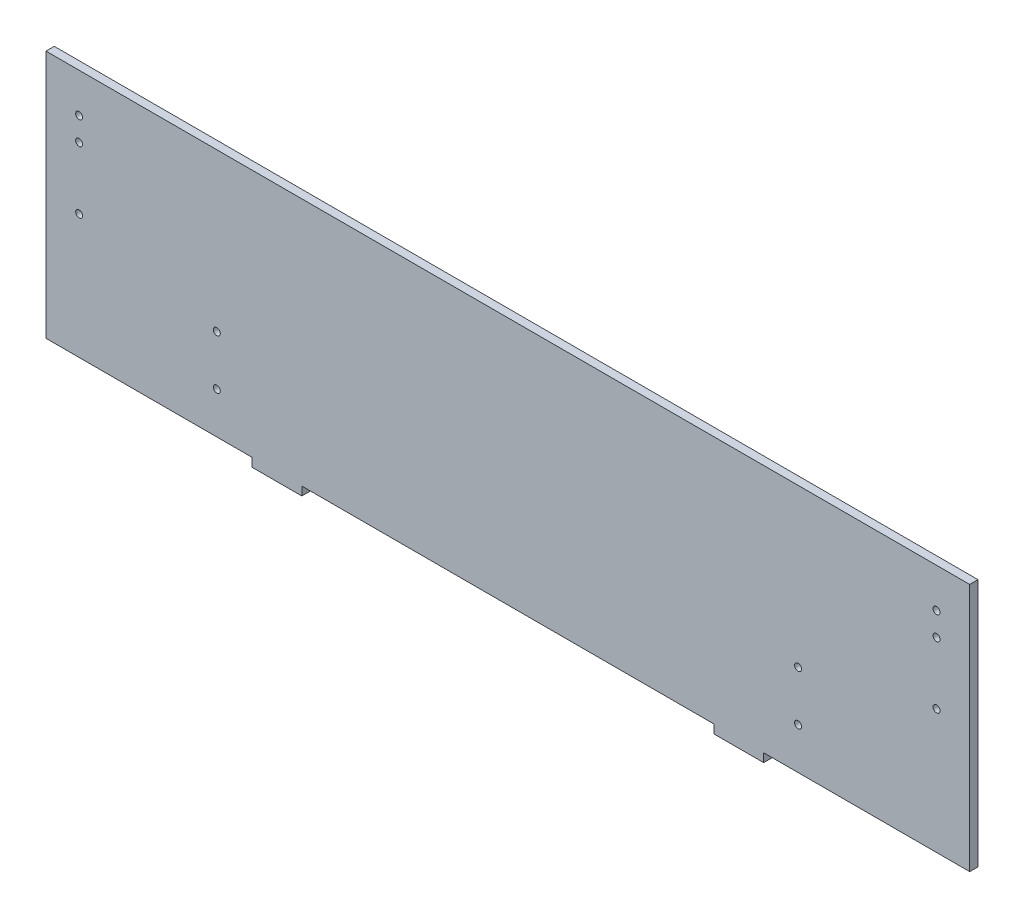
ISO-10303-21;
HEADER;
FILE_DESCRIPTION(('STEP AP214'),'2;1');
FILE_NAME('part.step','',(''),(''),'','','');
FILE_SCHEMA(('AUTOMOTIVE_DESIGN { 1 0 10303 214 1 1 1 1 }'));
ENDSEC;
DATA;
#1=APPLICATION_CONTEXT('core data for automotive mechanical design processes');
#2=APPLICATION_PROTOCOL_DEFINITION('international standard','automotive_design',2000,#1);
#3=PRODUCT_CONTEXT('',#1,'mechanical');
#4=PRODUCT('Part','Part','',(#3));
#5=PRODUCT_RELATED_PRODUCT_CATEGORY('part','',(#4));
#6=PRODUCT_DEFINITION_FORMATION('','',#4);
#7=PRODUCT_DEFINITION_CONTEXT('part definition',#1,'design');
#8=PRODUCT_DEFINITION('design','',#6,#7);
#9=PRODUCT_DEFINITION_SHAPE('','',#8);
#10=(LENGTH_UNIT() NAMED_UNIT(*) SI_UNIT(.MILLI.,.METRE.));
#11=(NAMED_UNIT(*) PLANE_ANGLE_UNIT() SI_UNIT($,.RADIAN.));
#12=(NAMED_UNIT(*) SI_UNIT($,.STERADIAN.) SOLID_ANGLE_UNIT());
#13=UNCERTAINTY_MEASURE_WITH_UNIT(LENGTH_MEASURE(1.E-05),#10,'distance_accuracy_value','');
#14=(GEOMETRIC_REPRESENTATION_CONTEXT(3) GLOBAL_UNCERTAINTY_ASSIGNED_CONTEXT((#13)) GLOBAL_UNIT_ASSIGNED_CONTEXT((#10,
#11,#12)) REPRESENTATION_CONTEXT('',''));
#15=CARTESIAN_POINT('',(0.,0.,0.));
#16=DIRECTION('',(0.,0.,1.));
#17=DIRECTION('',(1.,0.,0.));
#18=AXIS2_PLACEMENT_3D('',#15,#16,#17);
#19=CARTESIAN_POINT('',(-296.012478204129,-155.075206465411,5.));
#20=DIRECTION('',(0.,1.,0.));
#21=DIRECTION('',(0.,0.,1.));
#22=AXIS2_PLACEMENT_3D('',#19,#20,#21);
#23=PLANE('',#22);
#24=DIRECTION('',(1.,0.,0.));
#25=VECTOR('',#24,1.);
#26=CARTESIAN_POINT('',(-296.012478204129,-155.075206465411,5.));
#27=LINE('',#26,#25);
#28=CARTESIAN_POINT('',(136.737521795871,-155.075206465411,5.));
#29=VERTEX_POINT('',#28);
#30=CARTESIAN_POINT('',(260.987521795871,-155.075206465411,5.));
#31=VERTEX_POINT('',#30);
#32=EDGE_CURVE('E232',#29,#31,#27,.T.);
#33=ORIENTED_EDGE('',*,*,#32,.F.);
#34=DIRECTION('',(0.,0.,-1.));
#35=VECTOR('',#34,1.);
#36=CARTESIAN_POINT('',(136.737521795871,-155.075206465411,5.));
#37=LINE('',#36,#35);
#38=CARTESIAN_POINT('',(136.737521795871,-155.075206465411,0.));
#39=VERTEX_POINT('',#38);
#40=EDGE_CURVE('E190',#29,#39,#37,.T.);
#41=ORIENTED_EDGE('',*,*,#40,.T.);
#42=DIRECTION('',(1.,0.,0.));
#43=VECTOR('',#42,1.);
#44=CARTESIAN_POINT('',(-296.012478204129,-155.075206465411,0.));
#45=LINE('',#44,#43);
#46=CARTESIAN_POINT('',(260.987521795871,-155.075206465411,0.));
#47=VERTEX_POINT('',#46);
#48=EDGE_CURVE('E248',#39,#47,#45,.T.);
#49=ORIENTED_EDGE('',*,*,#48,.T.);
#50=DIRECTION('',(0.,0.,-1.));
#51=VECTOR('',#50,1.);
#52=CARTESIAN_POINT('',(260.987521795871,-155.075206465411,5.));
#53=LINE('',#52,#51);
#54=EDGE_CURVE('E64',#31,#47,#53,.T.);
#55=ORIENTED_EDGE('',*,*,#54,.F.);
#56=EDGE_LOOP('',(#33,#41,#49,#55));
#57=FACE_BOUND('',#56,.T.);
#58=ADVANCED_FACE('F54',(#57),#23,.F.);
#59=CARTESIAN_POINT('',(-141.762478204129,-155.075206465411,0.));
#60=VERTEX_POINT('',#59);
#61=CARTESIAN_POINT('',(106.737521795871,-155.075206465411,0.));
#62=VERTEX_POINT('',#61);
#63=EDGE_CURVE('E254',#60,#62,#45,.T.);
#64=ORIENTED_EDGE('',*,*,#63,.T.);
#65=DIRECTION('',(0.,0.,1.));
#66=VECTOR('',#65,1.);
#67=CARTESIAN_POINT('',(106.737521795871,-155.075206465411,5.));
#68=LINE('',#67,#66);
#69=CARTESIAN_POINT('',(106.737521795871,-155.075206465411,5.));
#70=VERTEX_POINT('',#69);
#71=EDGE_CURVE('E154',#62,#70,#68,.T.);
#72=ORIENTED_EDGE('',*,*,#71,.T.);
#73=CARTESIAN_POINT('',(-141.762478204129,-155.075206465411,5.));
#74=VERTEX_POINT('',#73);
#75=EDGE_CURVE('E238',#74,#70,#27,.T.);
#76=ORIENTED_EDGE('',*,*,#75,.F.);
#77=DIRECTION('',(0.,0.,-1.));
#78=VECTOR('',#77,1.);
#79=CARTESIAN_POINT('',(-141.762478204129,-155.075206465411,5.));
#80=LINE('',#79,#78);
#81=EDGE_CURVE('E223',#74,#60,#80,.T.);
#82=ORIENTED_EDGE('',*,*,#81,.T.);
#83=EDGE_LOOP('',(#64,#72,#76,#82));
#84=FACE_BOUND('',#83,.T.);
#85=ADVANCED_FACE('F307',(#84),#23,.F.);
#86=CARTESIAN_POINT('',(-296.012478204129,-5.07520646541149,5.));
#87=DIRECTION('',(1.,0.,0.));
#88=DIRECTION('',(0.,0.,-1.));
#89=AXIS2_PLACEMENT_3D('',#86,#87,#88);
#90=PLANE('',#89);
#91=DIRECTION('',(0.,-1.,0.));
#92=VECTOR('',#91,1.);
#93=CARTESIAN_POINT('',(-296.012478204129,-5.07520646541149,0.));
#94=LINE('',#93,#92);
#95=CARTESIAN_POINT('',(-296.012478204129,-5.07520646541149,0.));
#96=VERTEX_POINT('',#95);
#97=CARTESIAN_POINT('',(-296.012478204129,-155.075206465411,0.));
#98=VERTEX_POINT('',#97);
#99=EDGE_CURVE('E227',#96,#98,#94,.T.);
#100=ORIENTED_EDGE('',*,*,#99,.T.);
#101=DIRECTION('',(0.,0.,-1.));
#102=VECTOR('',#101,1.);
#103=CARTESIAN_POINT('',(-296.012478204129,-155.075206465411,5.));
#104=LINE('',#103,#102);
#105=CARTESIAN_POINT('',(-296.012478204129,-155.075206465411,5.));
#106=VERTEX_POINT('',#105);
#107=EDGE_CURVE('E13',#106,#98,#104,.T.);
#108=ORIENTED_EDGE('',*,*,#107,.F.);
#109=DIRECTION('',(0.,-1.,0.));
#110=VECTOR('',#109,1.);
#111=CARTESIAN_POINT('',(-296.012478204129,-5.07520646541149,5.));
#112=LINE('',#111,#110);
#113=CARTESIAN_POINT('',(-296.012478204129,-5.07520646541149,5.));
#114=VERTEX_POINT('',#113);
#115=EDGE_CURVE('E228',#114,#106,#112,.T.);
#116=ORIENTED_EDGE('',*,*,#115,.F.);
#117=DIRECTION('',(0.,0.,-1.));
#118=VECTOR('',#117,1.);
#119=CARTESIAN_POINT('',(-296.012478204129,-5.07520646541149,5.));
#120=LINE('',#119,#118);
#121=EDGE_CURVE('E244',#114,#96,#120,.T.);
#122=ORIENTED_EDGE('',*,*,#121,.T.);
#123=EDGE_LOOP('',(#100,#108,#116,#122));
#124=FACE_BOUND('',#123,.T.);
#125=ADVANCED_FACE('F56',(#124),#90,.F.);
#126=CARTESIAN_POINT('',(-171.762478204129,-155.075206465411,0.));
#127=VERTEX_POINT('',#126);
#128=EDGE_CURVE('E249',#98,#127,#45,.T.);
#129=ORIENTED_EDGE('',*,*,#128,.T.);
#130=DIRECTION('',(0.,0.,1.));
#131=VECTOR('',#130,1.);
#132=CARTESIAN_POINT('',(-171.762478204129,-155.075206465411,5.));
#133=LINE('',#132,#131);
#134=CARTESIAN_POINT('',(-171.762478204129,-155.075206465411,5.));
#135=VERTEX_POINT('',#134);
#136=EDGE_CURVE('E216',#127,#135,#133,.T.);
#137=ORIENTED_EDGE('',*,*,#136,.T.);
#138=EDGE_CURVE('E234',#106,#135,#27,.T.);
#139=ORIENTED_EDGE('',*,*,#138,.F.);
#140=ORIENTED_EDGE('',*,*,#107,.T.);
#141=EDGE_LOOP('',(#129,#137,#139,#140));
#142=FACE_BOUND('',#141,.T.);
#143=ADVANCED_FACE('F309',(#142),#23,.F.);
#144=CARTESIAN_POINT('',(260.987521795871,-5.07520646541149,5.));
#145=DIRECTION('',(-1.,0.,0.));
#146=DIRECTION('',(0.,-1.,0.));
#147=AXIS2_PLACEMENT_3D('',#144,#145,#146);
#148=PLANE('',#147);
#149=DIRECTION('',(0.,1.,0.));
#150=VECTOR('',#149,1.);
#151=CARTESIAN_POINT('',(260.987521795871,-5.07520646541149,0.));
#152=LINE('',#151,#150);
#153=CARTESIAN_POINT('',(260.987521795871,-5.07520646541149,0.));
#154=VERTEX_POINT('',#153);
#155=EDGE_CURVE('E253',#47,#154,#152,.T.);
#156=ORIENTED_EDGE('',*,*,#155,.T.);
#157=DIRECTION('',(0.,0.,-1.));
#158=VECTOR('',#157,1.);
#159=CARTESIAN_POINT('',(260.987521795871,-5.07520646541149,5.));
#160=LINE('',#159,#158);
#161=CARTESIAN_POINT('',(260.987521795871,-5.07520646541149,5.));
#162=VERTEX_POINT('',#161);
#163=EDGE_CURVE('E262',#162,#154,#160,.T.);
#164=ORIENTED_EDGE('',*,*,#163,.F.);
#165=DIRECTION('',(0.,1.,0.));
#166=VECTOR('',#165,1.);
#167=CARTESIAN_POINT('',(260.987521795871,-5.07520646541149,5.));
#168=LINE('',#167,#166);
#169=EDGE_CURVE('E237',#31,#162,#168,.T.);
#170=ORIENTED_EDGE('',*,*,#169,.F.);
#171=ORIENTED_EDGE('',*,*,#54,.T.);
#172=EDGE_LOOP('',(#156,#164,#170,#171));
#173=FACE_BOUND('',#172,.T.);
#174=ADVANCED_FACE('F317',(#173),#148,.F.);
#175=CARTESIAN_POINT('',(-296.012478204129,-5.07520646541149,5.));
#176=DIRECTION('',(0.,-1.,0.));
#177=DIRECTION('',(0.,0.,-1.));
#178=AXIS2_PLACEMENT_3D('',#175,#176,#177);
#179=PLANE('',#178);
#180=DIRECTION('',(-1.,0.,0.));
#181=VECTOR('',#180,1.);
#182=CARTESIAN_POINT('',(-296.012478204129,-5.07520646541149,0.));
#183=LINE('',#182,#181);
#184=EDGE_CURVE('E233',#154,#96,#183,.T.);
#185=ORIENTED_EDGE('',*,*,#184,.T.);
#186=ORIENTED_EDGE('',*,*,#121,.F.);
#187=DIRECTION('',(-1.,0.,0.));
#188=VECTOR('',#187,1.);
#189=CARTESIAN_POINT('',(-296.012478204129,-5.07520646541149,5.));
#190=LINE('',#189,#188);
#191=EDGE_CURVE('E241',#162,#114,#190,.T.);
#192=ORIENTED_EDGE('',*,*,#191,.F.);
#193=ORIENTED_EDGE('',*,*,#163,.T.);
#194=EDGE_LOOP('',(#185,#186,#192,#193));
#195=FACE_BOUND('',#194,.T.);
#196=ADVANCED_FACE('F323',(#195),#179,.F.);
#197=CARTESIAN_POINT('',(0.,0.,5.));
#198=DIRECTION('',(0.,0.,1.));
#199=DIRECTION('',(1.,0.,0.));
#200=AXIS2_PLACEMENT_3D('',#197,#198,#199);
#201=PLANE('',#200);
#202=CARTESIAN_POINT('',(-193.012478204129,-130.075206465411,5.));
#203=DIRECTION('',(0.,0.,1.));
#204=DIRECTION('',(1.,0.,0.));
#205=AXIS2_PLACEMENT_3D('',#202,#203,#204);
#206=CIRCLE('',#205,2.09999999999999);
#207=CARTESIAN_POINT('',(-190.912478204129,-130.075206465411,5.));
#208=VERTEX_POINT('',#207);
#209=EDGE_CURVE('E617',#208,#208,#206,.T.);
#210=ORIENTED_EDGE('',*,*,#209,.F.);
#211=EDGE_LOOP('',(#210));
#212=FACE_BOUND('',#211,.T.);
#213=CARTESIAN_POINT('',(-193.012478204129,-100.075206465411,5.));
#214=DIRECTION('',(0.,0.,1.));
#215=DIRECTION('',(1.,0.,0.));
#216=AXIS2_PLACEMENT_3D('',#213,#214,#215);
#217=CIRCLE('',#216,2.09999999999999);
#218=CARTESIAN_POINT('',(-190.912478204129,-100.075206465411,5.));
#219=VERTEX_POINT('',#218);
#220=EDGE_CURVE('E621',#219,#219,#217,.T.);
#221=ORIENTED_EDGE('',*,*,#220,.F.);
#222=EDGE_LOOP('',(#221));
#223=FACE_BOUND('',#222,.T.);
#224=CARTESIAN_POINT('',(157.487521795871,-130.075206465411,5.));
#225=DIRECTION('',(0.,0.,1.));
#226=DIRECTION('',(1.,0.,0.));
#227=AXIS2_PLACEMENT_3D('',#224,#225,#226);
#228=CIRCLE('',#227,2.09999999999999);
#229=CARTESIAN_POINT('',(159.587521795871,-130.075206465411,5.));
#230=VERTEX_POINT('',#229);
#231=EDGE_CURVE('E366',#230,#230,#228,.T.);
#232=ORIENTED_EDGE('',*,*,#231,.F.);
#233=EDGE_LOOP('',(#232));
#234=FACE_BOUND('',#233,.T.);
#235=CARTESIAN_POINT('',(157.487521795871,-100.075206465411,5.));
#236=DIRECTION('',(0.,0.,1.));
#237=DIRECTION('',(1.,0.,0.));
#238=AXIS2_PLACEMENT_3D('',#235,#236,#237);
#239=CIRCLE('',#238,2.10000000000002);
#240=CARTESIAN_POINT('',(159.587521795871,-100.075206465411,5.));
#241=VERTEX_POINT('',#240);
#242=EDGE_CURVE('E375',#241,#241,#239,.T.);
#243=ORIENTED_EDGE('',*,*,#242,.F.);
#244=EDGE_LOOP('',(#243));
#245=FACE_BOUND('',#244,.T.);
#246=CARTESIAN_POINT('',(240.987521795871,-80.0752064654115,5.));
#247=DIRECTION('',(0.,0.,1.));
#248=DIRECTION('',(1.,0.,0.));
#249=AXIS2_PLACEMENT_3D('',#246,#247,#248);
#250=CIRCLE('',#249,2.09999999999999);
#251=CARTESIAN_POINT('',(243.087521795871,-80.0752064654115,5.));
#252=VERTEX_POINT('',#251);
#253=EDGE_CURVE('E357',#252,#252,#250,.T.);
#254=ORIENTED_EDGE('',*,*,#253,.F.);
#255=EDGE_LOOP('',(#254));
#256=FACE_BOUND('',#255,.T.);
#257=CARTESIAN_POINT('',(-276.012478204129,-80.0752064654115,5.));
#258=DIRECTION('',(0.,0.,1.));
#259=DIRECTION('',(1.,0.,0.));
#260=AXIS2_PLACEMENT_3D('',#257,#258,#259);
#261=CIRCLE('',#260,2.09999999999999);
#262=CARTESIAN_POINT('',(-273.912478204129,-80.0752064654115,5.));
#263=VERTEX_POINT('',#262);
#264=EDGE_CURVE('E360',#263,#263,#261,.T.);
#265=ORIENTED_EDGE('',*,*,#264,.F.);
#266=EDGE_LOOP('',(#265));
#267=FACE_BOUND('',#266,.T.);
#268=CARTESIAN_POINT('',(240.987521795871,-28.7052064654114,5.));
#269=DIRECTION('',(0.,0.,1.));
#270=DIRECTION('',(-1.,0.,0.));
#271=AXIS2_PLACEMENT_3D('',#268,#269,#270);
#272=CIRCLE('',#271,2.09999999999999);
#273=CARTESIAN_POINT('',(238.887521795871,-28.7052064654114,5.));
#274=VERTEX_POINT('',#273);
#275=EDGE_CURVE('E359',#274,#274,#272,.T.);
#276=ORIENTED_EDGE('',*,*,#275,.F.);
#277=EDGE_LOOP('',(#276));
#278=FACE_BOUND('',#277,.T.);
#279=CARTESIAN_POINT('',(240.987521795871,-42.7752064654114,5.));
#280=DIRECTION('',(0.,0.,1.));
#281=DIRECTION('',(-1.,0.,0.));
#282=AXIS2_PLACEMENT_3D('',#279,#280,#281);
#283=CIRCLE('',#282,2.09999999999999);
#284=CARTESIAN_POINT('',(238.887521795871,-42.7752064654114,5.));
#285=VERTEX_POINT('',#284);
#286=EDGE_CURVE('E385',#285,#285,#283,.T.);
#287=ORIENTED_EDGE('',*,*,#286,.F.);
#288=EDGE_LOOP('',(#287));
#289=FACE_BOUND('',#288,.T.);
#290=CARTESIAN_POINT('',(-276.012478204129,-42.7752064654115,5.));
#291=DIRECTION('',(0.,0.,1.));
#292=DIRECTION('',(1.,0.,0.));
#293=AXIS2_PLACEMENT_3D('',#290,#291,#292);
#294=CIRCLE('',#293,2.09999999999999);
#295=CARTESIAN_POINT('',(-273.912478204129,-42.7752064654115,5.));
#296=VERTEX_POINT('',#295);
#297=EDGE_CURVE('E381',#296,#296,#294,.T.);
#298=ORIENTED_EDGE('',*,*,#297,.F.);
#299=EDGE_LOOP('',(#298));
#300=FACE_BOUND('',#299,.T.);
#301=CARTESIAN_POINT('',(-276.012478204129,-28.7052064654115,5.));
#302=DIRECTION('',(0.,0.,1.));
#303=DIRECTION('',(1.,0.,0.));
#304=AXIS2_PLACEMENT_3D('',#301,#302,#303);
#305=CIRCLE('',#304,2.09999999999999);
#306=CARTESIAN_POINT('',(-273.912478204129,-28.7052064654115,5.));
#307=VERTEX_POINT('',#306);
#308=EDGE_CURVE('E274',#307,#307,#305,.T.);
#309=ORIENTED_EDGE('',*,*,#308,.F.);
#310=EDGE_LOOP('',(#309));
#311=FACE_BOUND('',#310,.T.);
#312=ORIENTED_EDGE('',*,*,#75,.T.);
#313=DIRECTION('',(0.,-1.,0.));
#314=VECTOR('',#313,1.);
#315=CARTESIAN_POINT('',(106.737521795871,-149.875206465411,5.));
#316=LINE('',#315,#314);
#317=CARTESIAN_POINT('',(106.737521795871,-160.275206465411,5.));
#318=VERTEX_POINT('',#317);
#319=EDGE_CURVE('E181',#70,#318,#316,.T.);
#320=ORIENTED_EDGE('',*,*,#319,.T.);
#321=DIRECTION('',(1.,0.,0.));
#322=VECTOR('',#321,1.);
#323=CARTESIAN_POINT('',(106.737521795871,-160.275206465411,5.));
#324=LINE('',#323,#322);
#325=CARTESIAN_POINT('',(136.737521795871,-160.275206465411,5.));
#326=VERTEX_POINT('',#325);
#327=EDGE_CURVE('E166',#318,#326,#324,.T.);
#328=ORIENTED_EDGE('',*,*,#327,.T.);
#329=DIRECTION('',(0.,1.,0.));
#330=VECTOR('',#329,1.);
#331=CARTESIAN_POINT('',(136.737521795871,-149.875206465411,5.));
#332=LINE('',#331,#330);
#333=EDGE_CURVE('E72',#326,#29,#332,.T.);
#334=ORIENTED_EDGE('',*,*,#333,.T.);
#335=ORIENTED_EDGE('',*,*,#32,.T.);
#336=ORIENTED_EDGE('',*,*,#169,.T.);
#337=ORIENTED_EDGE('',*,*,#191,.T.);
#338=ORIENTED_EDGE('',*,*,#115,.T.);
#339=ORIENTED_EDGE('',*,*,#138,.T.);
#340=DIRECTION('',(0.,-1.,0.));
#341=VECTOR('',#340,1.);
#342=CARTESIAN_POINT('',(-171.762478204129,-149.875206465412,5.));
#343=LINE('',#342,#341);
#344=CARTESIAN_POINT('',(-171.762478204129,-160.275206465412,5.));
#345=VERTEX_POINT('',#344);
#346=EDGE_CURVE('E208',#135,#345,#343,.T.);
#347=ORIENTED_EDGE('',*,*,#346,.T.);
#348=DIRECTION('',(1.,0.,0.));
#349=VECTOR('',#348,1.);
#350=CARTESIAN_POINT('',(-171.762478204129,-160.275206465412,5.));
#351=LINE('',#350,#349);
#352=CARTESIAN_POINT('',(-141.762478204129,-160.275206465412,5.));
#353=VERTEX_POINT('',#352);
#354=EDGE_CURVE('E198',#345,#353,#351,.T.);
#355=ORIENTED_EDGE('',*,*,#354,.T.);
#356=DIRECTION('',(0.,1.,0.));
#357=VECTOR('',#356,1.);
#358=CARTESIAN_POINT('',(-141.762478204129,-149.875206465412,5.));
#359=LINE('',#358,#357);
#360=EDGE_CURVE('E79',#353,#74,#359,.T.);
#361=ORIENTED_EDGE('',*,*,#360,.T.);
#362=EDGE_LOOP('',(#312,#320,#328,#334,#335,#336,#337,#338,#339,#347,#355,#361));
#363=FACE_BOUND('',#362,.T.);
#364=ADVANCED_FACE('F338',(#212,#223,#234,#245,#256,#267,#278,#289,#300,#311,#363),#201,.T.);
#365=CARTESIAN_POINT('',(0.,0.,0.));
#366=DIRECTION('',(0.,0.,1.));
#367=DIRECTION('',(1.,0.,0.));
#368=AXIS2_PLACEMENT_3D('',#365,#366,#367);
#369=PLANE('',#368);
#370=CARTESIAN_POINT('',(-193.012478204129,-130.075206465411,0.));
#371=DIRECTION('',(0.,0.,-1.));
#372=DIRECTION('',(-1.,0.,0.));
#373=AXIS2_PLACEMENT_3D('',#370,#371,#372);
#374=CIRCLE('',#373,2.09999999999999);
#375=CARTESIAN_POINT('',(-195.112478204129,-130.075206465411,0.));
#376=VERTEX_POINT('',#375);
#377=EDGE_CURVE('E620',#376,#376,#374,.T.);
#378=ORIENTED_EDGE('',*,*,#377,.F.);
#379=EDGE_LOOP('',(#378));
#380=FACE_BOUND('',#379,.T.);
#381=CARTESIAN_POINT('',(-193.012478204129,-100.075206465411,0.));
#382=DIRECTION('',(0.,0.,-1.));
#383=DIRECTION('',(-1.,0.,0.));
#384=AXIS2_PLACEMENT_3D('',#381,#382,#383);
#385=CIRCLE('',#384,2.09999999999999);
#386=CARTESIAN_POINT('',(-195.112478204129,-100.075206465411,0.));
#387=VERTEX_POINT('',#386);
#388=EDGE_CURVE('E622',#387,#387,#385,.T.);
#389=ORIENTED_EDGE('',*,*,#388,.F.);
#390=EDGE_LOOP('',(#389));
#391=FACE_BOUND('',#390,.T.);
#392=CARTESIAN_POINT('',(157.487521795871,-130.075206465411,0.));
#393=DIRECTION('',(0.,0.,-1.));
#394=DIRECTION('',(-1.,0.,0.));
#395=AXIS2_PLACEMENT_3D('',#392,#393,#394);
#396=CIRCLE('',#395,2.09999999999999);
#397=CARTESIAN_POINT('',(155.387521795871,-130.075206465411,0.));
#398=VERTEX_POINT('',#397);
#399=EDGE_CURVE('E633',#398,#398,#396,.T.);
#400=ORIENTED_EDGE('',*,*,#399,.F.);
#401=EDGE_LOOP('',(#400));
#402=FACE_BOUND('',#401,.T.);
#403=CARTESIAN_POINT('',(157.487521795871,-100.075206465411,0.));
#404=DIRECTION('',(0.,0.,-1.));
#405=DIRECTION('',(-1.,0.,0.));
#406=AXIS2_PLACEMENT_3D('',#403,#404,#405);
#407=CIRCLE('',#406,2.10000000000002);
#408=CARTESIAN_POINT('',(155.387521795871,-100.075206465411,0.));
#409=VERTEX_POINT('',#408);
#410=EDGE_CURVE('E632',#409,#409,#407,.T.);
#411=ORIENTED_EDGE('',*,*,#410,.F.);
#412=EDGE_LOOP('',(#411));
#413=FACE_BOUND('',#412,.T.);
#414=CARTESIAN_POINT('',(240.987521795871,-80.0752064654115,0.));
#415=DIRECTION('',(0.,0.,-1.));
#416=DIRECTION('',(-1.,0.,0.));
#417=AXIS2_PLACEMENT_3D('',#414,#415,#416);
#418=CIRCLE('',#417,2.09999999999999);
#419=CARTESIAN_POINT('',(238.887521795871,-80.0752064654115,0.));
#420=VERTEX_POINT('',#419);
#421=EDGE_CURVE('E365',#420,#420,#418,.T.);
#422=ORIENTED_EDGE('',*,*,#421,.F.);
#423=EDGE_LOOP('',(#422));
#424=FACE_BOUND('',#423,.T.);
#425=CARTESIAN_POINT('',(-276.012478204129,-80.0752064654115,0.));
#426=DIRECTION('',(0.,0.,-1.));
#427=DIRECTION('',(-1.,0.,0.));
#428=AXIS2_PLACEMENT_3D('',#425,#426,#427);
#429=CIRCLE('',#428,2.09999999999999);
#430=CARTESIAN_POINT('',(-278.112478204129,-80.0752064654115,0.));
#431=VERTEX_POINT('',#430);
#432=EDGE_CURVE('E363',#431,#431,#429,.T.);
#433=ORIENTED_EDGE('',*,*,#432,.F.);
#434=EDGE_LOOP('',(#433));
#435=FACE_BOUND('',#434,.T.);
#436=CARTESIAN_POINT('',(240.987521795871,-28.7052064654114,0.));
#437=DIRECTION('',(0.,0.,1.));
#438=DIRECTION('',(1.,0.,0.));
#439=AXIS2_PLACEMENT_3D('',#436,#437,#438);
#440=CIRCLE('',#439,2.09999999999999);
#441=CARTESIAN_POINT('',(243.087521795871,-28.7052064654114,0.));
#442=VERTEX_POINT('',#441);
#443=EDGE_CURVE('E58',#442,#442,#440,.T.);
#444=ORIENTED_EDGE('',*,*,#443,.T.);
#445=EDGE_LOOP('',(#444));
#446=FACE_BOUND('',#445,.T.);
#447=CARTESIAN_POINT('',(240.987521795871,-42.7752064654114,0.));
#448=DIRECTION('',(0.,0.,1.));
#449=DIRECTION('',(1.,0.,0.));
#450=AXIS2_PLACEMENT_3D('',#447,#448,#449);
#451=CIRCLE('',#450,2.09999999999999);
#452=CARTESIAN_POINT('',(243.087521795871,-42.7752064654114,0.));
#453=VERTEX_POINT('',#452);
#454=EDGE_CURVE('E277',#453,#453,#451,.T.);
#455=ORIENTED_EDGE('',*,*,#454,.T.);
#456=EDGE_LOOP('',(#455));
#457=FACE_BOUND('',#456,.T.);
#458=CARTESIAN_POINT('',(-276.012478204129,-42.7752064654115,0.));
#459=DIRECTION('',(0.,0.,1.));
#460=DIRECTION('',(1.,0.,0.));
#461=AXIS2_PLACEMENT_3D('',#458,#459,#460);
#462=CIRCLE('',#461,2.09999999999999);
#463=CARTESIAN_POINT('',(-273.912478204129,-42.7752064654115,0.));
#464=VERTEX_POINT('',#463);
#465=EDGE_CURVE('E273',#464,#464,#462,.T.);
#466=ORIENTED_EDGE('',*,*,#465,.T.);
#467=EDGE_LOOP('',(#466));
#468=FACE_BOUND('',#467,.T.);
#469=CARTESIAN_POINT('',(-276.012478204129,-28.7052064654115,0.));
#470=DIRECTION('',(0.,0.,1.));
#471=DIRECTION('',(1.,0.,0.));
#472=AXIS2_PLACEMENT_3D('',#469,#470,#471);
#473=CIRCLE('',#472,2.09999999999999);
#474=CARTESIAN_POINT('',(-273.912478204129,-28.7052064654115,0.));
#475=VERTEX_POINT('',#474);
#476=EDGE_CURVE('E269',#475,#475,#473,.T.);
#477=ORIENTED_EDGE('',*,*,#476,.T.);
#478=EDGE_LOOP('',(#477));
#479=FACE_BOUND('',#478,.T.);
#480=ORIENTED_EDGE('',*,*,#48,.F.);
#481=DIRECTION('',(0.,1.,0.));
#482=VECTOR('',#481,1.);
#483=CARTESIAN_POINT('',(136.737521795871,-149.875206465411,0.));
#484=LINE('',#483,#482);
#485=CARTESIAN_POINT('',(136.737521795871,-160.275206465411,0.));
#486=VERTEX_POINT('',#485);
#487=EDGE_CURVE('E161',#486,#39,#484,.T.);
#488=ORIENTED_EDGE('',*,*,#487,.F.);
#489=DIRECTION('',(1.,0.,0.));
#490=VECTOR('',#489,1.);
#491=CARTESIAN_POINT('',(106.737521795871,-160.275206465411,0.));
#492=LINE('',#491,#490);
#493=CARTESIAN_POINT('',(106.737521795871,-160.275206465411,0.));
#494=VERTEX_POINT('',#493);
#495=EDGE_CURVE('E160',#494,#486,#492,.T.);
#496=ORIENTED_EDGE('',*,*,#495,.F.);
#497=DIRECTION('',(0.,-1.,0.));
#498=VECTOR('',#497,1.);
#499=CARTESIAN_POINT('',(106.737521795871,-149.875206465411,0.));
#500=LINE('',#499,#498);
#501=EDGE_CURVE('E148',#62,#494,#500,.T.);
#502=ORIENTED_EDGE('',*,*,#501,.F.);
#503=ORIENTED_EDGE('',*,*,#63,.F.);
#504=DIRECTION('',(0.,1.,0.));
#505=VECTOR('',#504,1.);
#506=CARTESIAN_POINT('',(-141.762478204129,-149.875206465412,0.));
#507=LINE('',#506,#505);
#508=CARTESIAN_POINT('',(-141.762478204129,-160.275206465412,0.));
#509=VERTEX_POINT('',#508);
#510=EDGE_CURVE('E194',#509,#60,#507,.T.);
#511=ORIENTED_EDGE('',*,*,#510,.F.);
#512=DIRECTION('',(1.,0.,0.));
#513=VECTOR('',#512,1.);
#514=CARTESIAN_POINT('',(-171.762478204129,-160.275206465412,0.));
#515=LINE('',#514,#513);
#516=CARTESIAN_POINT('',(-171.762478204129,-160.275206465412,0.));
#517=VERTEX_POINT('',#516);
#518=EDGE_CURVE('E201',#517,#509,#515,.T.);
#519=ORIENTED_EDGE('',*,*,#518,.F.);
#520=DIRECTION('',(0.,-1.,0.));
#521=VECTOR('',#520,1.);
#522=CARTESIAN_POINT('',(-171.762478204129,-149.875206465412,0.));
#523=LINE('',#522,#521);
#524=EDGE_CURVE('E197',#127,#517,#523,.T.);
#525=ORIENTED_EDGE('',*,*,#524,.F.);
#526=ORIENTED_EDGE('',*,*,#128,.F.);
#527=ORIENTED_EDGE('',*,*,#99,.F.);
#528=ORIENTED_EDGE('',*,*,#184,.F.);
#529=ORIENTED_EDGE('',*,*,#155,.F.);
#530=EDGE_LOOP('',(#480,#488,#496,#502,#503,#511,#519,#525,#526,#527,#528,#529));
#531=FACE_BOUND('',#530,.T.);
#532=ADVANCED_FACE('F172',(#380,#391,#402,#413,#424,#435,#446,#457,#468,#479,#531),#369,.F.);
#533=CARTESIAN_POINT('',(-141.762478204129,-149.875206465412,0.));
#534=DIRECTION('',(1.,0.,0.));
#535=DIRECTION('',(0.,0.,-1.));
#536=AXIS2_PLACEMENT_3D('',#533,#534,#535);
#537=PLANE('',#536);
#538=ORIENTED_EDGE('',*,*,#81,.F.);
#539=ORIENTED_EDGE('',*,*,#360,.F.);
#540=DIRECTION('',(0.,0.,1.));
#541=VECTOR('',#540,1.);
#542=CARTESIAN_POINT('',(-141.762478204129,-160.275206465412,0.));
#543=LINE('',#542,#541);
#544=EDGE_CURVE('E213',#509,#353,#543,.T.);
#545=ORIENTED_EDGE('',*,*,#544,.F.);
#546=ORIENTED_EDGE('',*,*,#510,.T.);
#547=EDGE_LOOP('',(#538,#539,#545,#546));
#548=FACE_BOUND('',#547,.T.);
#549=ADVANCED_FACE('F353',(#548),#537,.T.);
#550=CARTESIAN_POINT('',(-171.762478204129,-149.875206465412,0.));
#551=DIRECTION('',(-1.,0.,0.));
#552=DIRECTION('',(0.,0.,1.));
#553=AXIS2_PLACEMENT_3D('',#550,#551,#552);
#554=PLANE('',#553);
#555=ORIENTED_EDGE('',*,*,#136,.F.);
#556=ORIENTED_EDGE('',*,*,#524,.T.);
#557=DIRECTION('',(0.,0.,1.));
#558=VECTOR('',#557,1.);
#559=CARTESIAN_POINT('',(-171.762478204129,-160.275206465412,0.));
#560=LINE('',#559,#558);
#561=EDGE_CURVE('E205',#517,#345,#560,.T.);
#562=ORIENTED_EDGE('',*,*,#561,.T.);
#563=ORIENTED_EDGE('',*,*,#346,.F.);
#564=EDGE_LOOP('',(#555,#556,#562,#563));
#565=FACE_BOUND('',#564,.T.);
#566=ADVANCED_FACE('F334',(#565),#554,.T.);
#567=CARTESIAN_POINT('',(-171.762478204129,-160.275206465412,0.));
#568=DIRECTION('',(0.,-1.,0.));
#569=DIRECTION('',(0.,0.,-1.));
#570=AXIS2_PLACEMENT_3D('',#567,#568,#569);
#571=PLANE('',#570);
#572=ORIENTED_EDGE('',*,*,#354,.F.);
#573=ORIENTED_EDGE('',*,*,#561,.F.);
#574=ORIENTED_EDGE('',*,*,#518,.T.);
#575=ORIENTED_EDGE('',*,*,#544,.T.);
#576=EDGE_LOOP('',(#572,#573,#574,#575));
#577=FACE_BOUND('',#576,.T.);
#578=ADVANCED_FACE('F337',(#577),#571,.T.);
#579=CARTESIAN_POINT('',(136.737521795871,-149.875206465411,0.));
#580=DIRECTION('',(1.,0.,0.));
#581=DIRECTION('',(0.,0.,-1.));
#582=AXIS2_PLACEMENT_3D('',#579,#580,#581);
#583=PLANE('',#582);
#584=ORIENTED_EDGE('',*,*,#40,.F.);
#585=ORIENTED_EDGE('',*,*,#333,.F.);
#586=DIRECTION('',(0.,0.,1.));
#587=VECTOR('',#586,1.);
#588=CARTESIAN_POINT('',(136.737521795871,-160.275206465411,0.));
#589=LINE('',#588,#587);
#590=EDGE_CURVE('E168',#486,#326,#589,.T.);
#591=ORIENTED_EDGE('',*,*,#590,.F.);
#592=ORIENTED_EDGE('',*,*,#487,.T.);
#593=EDGE_LOOP('',(#584,#585,#591,#592));
#594=FACE_BOUND('',#593,.T.);
#595=ADVANCED_FACE('F394',(#594),#583,.T.);
#596=CARTESIAN_POINT('',(106.737521795871,-149.875206465411,0.));
#597=DIRECTION('',(-1.,0.,0.));
#598=DIRECTION('',(0.,0.,1.));
#599=AXIS2_PLACEMENT_3D('',#596,#597,#598);
#600=PLANE('',#599);
#601=ORIENTED_EDGE('',*,*,#71,.F.);
#602=ORIENTED_EDGE('',*,*,#501,.T.);
#603=DIRECTION('',(0.,0.,1.));
#604=VECTOR('',#603,1.);
#605=CARTESIAN_POINT('',(106.737521795871,-160.275206465411,0.));
#606=LINE('',#605,#604);
#607=EDGE_CURVE('E151',#494,#318,#606,.T.);
#608=ORIENTED_EDGE('',*,*,#607,.T.);
#609=ORIENTED_EDGE('',*,*,#319,.F.);
#610=EDGE_LOOP('',(#601,#602,#608,#609));
#611=FACE_BOUND('',#610,.T.);
#612=ADVANCED_FACE('F150',(#611),#600,.T.);
#613=CARTESIAN_POINT('',(106.737521795871,-160.275206465411,0.));
#614=DIRECTION('',(0.,-1.,0.));
#615=DIRECTION('',(0.,0.,-1.));
#616=AXIS2_PLACEMENT_3D('',#613,#614,#615);
#617=PLANE('',#616);
#618=ORIENTED_EDGE('',*,*,#327,.F.);
#619=ORIENTED_EDGE('',*,*,#607,.F.);
#620=ORIENTED_EDGE('',*,*,#495,.T.);
#621=ORIENTED_EDGE('',*,*,#590,.T.);
#622=EDGE_LOOP('',(#618,#619,#620,#621));
#623=FACE_BOUND('',#622,.T.);
#624=ADVANCED_FACE('F165',(#623),#617,.T.);
#625=CARTESIAN_POINT('',(-276.012478204129,-28.7052064654115,-5.));
#626=DIRECTION('',(0.,0.,1.));
#627=DIRECTION('',(1.,0.,0.));
#628=AXIS2_PLACEMENT_3D('',#625,#626,#627);
#629=CYLINDRICAL_SURFACE('',#628,2.09999999999999);
#630=ORIENTED_EDGE('',*,*,#308,.T.);
#631=EDGE_LOOP('',(#630));
#632=FACE_BOUND('',#631,.T.);
#633=ORIENTED_EDGE('',*,*,#476,.F.);
#634=EDGE_LOOP('',(#633));
#635=FACE_BOUND('',#634,.T.);
#636=ADVANCED_FACE('F450',(#632,#635),#629,.F.);
#637=CARTESIAN_POINT('',(-276.012478204129,-42.7752064654115,-5.));
#638=DIRECTION('',(0.,0.,1.));
#639=DIRECTION('',(1.,0.,0.));
#640=AXIS2_PLACEMENT_3D('',#637,#638,#639);
#641=CYLINDRICAL_SURFACE('',#640,2.09999999999999);
#642=ORIENTED_EDGE('',*,*,#297,.T.);
#643=EDGE_LOOP('',(#642));
#644=FACE_BOUND('',#643,.T.);
#645=ORIENTED_EDGE('',*,*,#465,.F.);
#646=EDGE_LOOP('',(#645));
#647=FACE_BOUND('',#646,.T.);
#648=ADVANCED_FACE('F301',(#644,#647),#641,.F.);
#649=CARTESIAN_POINT('',(240.987521795871,-42.7752064654114,-5.));
#650=DIRECTION('',(0.,0.,1.));
#651=DIRECTION('',(1.,0.,0.));
#652=AXIS2_PLACEMENT_3D('',#649,#650,#651);
#653=CYLINDRICAL_SURFACE('',#652,2.09999999999999);
#654=ORIENTED_EDGE('',*,*,#286,.T.);
#655=EDGE_LOOP('',(#654));
#656=FACE_BOUND('',#655,.T.);
#657=ORIENTED_EDGE('',*,*,#454,.F.);
#658=EDGE_LOOP('',(#657));
#659=FACE_BOUND('',#658,.T.);
#660=ADVANCED_FACE('F291',(#656,#659),#653,.F.);
#661=CARTESIAN_POINT('',(240.987521795871,-28.7052064654114,-5.));
#662=DIRECTION('',(0.,0.,1.));
#663=DIRECTION('',(1.,0.,0.));
#664=AXIS2_PLACEMENT_3D('',#661,#662,#663);
#665=CYLINDRICAL_SURFACE('',#664,2.09999999999999);
#666=ORIENTED_EDGE('',*,*,#275,.T.);
#667=EDGE_LOOP('',(#666));
#668=FACE_BOUND('',#667,.T.);
#669=ORIENTED_EDGE('',*,*,#443,.F.);
#670=EDGE_LOOP('',(#669));
#671=FACE_BOUND('',#670,.T.);
#672=ADVANCED_FACE('F288',(#668,#671),#665,.F.);
#673=CARTESIAN_POINT('',(-276.012478204129,-80.0752064654115,10.));
#674=DIRECTION('',(0.,0.,-1.));
#675=DIRECTION('',(-1.,0.,0.));
#676=AXIS2_PLACEMENT_3D('',#673,#674,#675);
#677=CYLINDRICAL_SURFACE('',#676,2.09999999999999);
#678=ORIENTED_EDGE('',*,*,#264,.T.);
#679=EDGE_LOOP('',(#678));
#680=FACE_BOUND('',#679,.T.);
#681=ORIENTED_EDGE('',*,*,#432,.T.);
#682=EDGE_LOOP('',(#681));
#683=FACE_BOUND('',#682,.T.);
#684=ADVANCED_FACE('F290',(#680,#683),#677,.F.);
#685=CARTESIAN_POINT('',(240.987521795871,-80.0752064654115,10.));
#686=DIRECTION('',(0.,0.,-1.));
#687=DIRECTION('',(-1.,0.,0.));
#688=AXIS2_PLACEMENT_3D('',#685,#686,#687);
#689=CYLINDRICAL_SURFACE('',#688,2.09999999999999);
#690=ORIENTED_EDGE('',*,*,#253,.T.);
#691=EDGE_LOOP('',(#690));
#692=FACE_BOUND('',#691,.T.);
#693=ORIENTED_EDGE('',*,*,#421,.T.);
#694=EDGE_LOOP('',(#693));
#695=FACE_BOUND('',#694,.T.);
#696=ADVANCED_FACE('F298',(#692,#695),#689,.F.);
#697=CARTESIAN_POINT('',(157.487521795871,-100.075206465411,10.));
#698=DIRECTION('',(0.,0.,-1.));
#699=DIRECTION('',(-1.,0.,0.));
#700=AXIS2_PLACEMENT_3D('',#697,#698,#699);
#701=CYLINDRICAL_SURFACE('',#700,2.10000000000002);
#702=ORIENTED_EDGE('',*,*,#242,.T.);
#703=EDGE_LOOP('',(#702));
#704=FACE_BOUND('',#703,.T.);
#705=ORIENTED_EDGE('',*,*,#410,.T.);
#706=EDGE_LOOP('',(#705));
#707=FACE_BOUND('',#706,.T.);
#708=ADVANCED_FACE('F485',(#704,#707),#701,.F.);
#709=CARTESIAN_POINT('',(157.487521795871,-130.075206465411,10.));
#710=DIRECTION('',(0.,0.,-1.));
#711=DIRECTION('',(-1.,0.,0.));
#712=AXIS2_PLACEMENT_3D('',#709,#710,#711);
#713=CYLINDRICAL_SURFACE('',#712,2.09999999999999);
#714=ORIENTED_EDGE('',*,*,#231,.T.);
#715=EDGE_LOOP('',(#714));
#716=FACE_BOUND('',#715,.T.);
#717=ORIENTED_EDGE('',*,*,#399,.T.);
#718=EDGE_LOOP('',(#717));
#719=FACE_BOUND('',#718,.T.);
#720=ADVANCED_FACE('F494',(#716,#719),#713,.F.);
#721=CARTESIAN_POINT('',(-193.012478204129,-100.075206465411,10.));
#722=DIRECTION('',(0.,0.,-1.));
#723=DIRECTION('',(-1.,0.,0.));
#724=AXIS2_PLACEMENT_3D('',#721,#722,#723);
#725=CYLINDRICAL_SURFACE('',#724,2.09999999999999);
#726=ORIENTED_EDGE('',*,*,#220,.T.);
#727=EDGE_LOOP('',(#726));
#728=FACE_BOUND('',#727,.T.);
#729=ORIENTED_EDGE('',*,*,#388,.T.);
#730=EDGE_LOOP('',(#729));
#731=FACE_BOUND('',#730,.T.);
#732=ADVANCED_FACE('F503',(#728,#731),#725,.F.);
#733=CARTESIAN_POINT('',(-193.012478204129,-130.075206465411,10.));
#734=DIRECTION('',(0.,0.,-1.));
#735=DIRECTION('',(-1.,0.,0.));
#736=AXIS2_PLACEMENT_3D('',#733,#734,#735);
#737=CYLINDRICAL_SURFACE('',#736,2.09999999999999);
#738=ORIENTED_EDGE('',*,*,#209,.T.);
#739=EDGE_LOOP('',(#738));
#740=FACE_BOUND('',#739,.T.);
#741=ORIENTED_EDGE('',*,*,#377,.T.);
#742=EDGE_LOOP('',(#741));
#743=FACE_BOUND('',#742,.T.);
#744=ADVANCED_FACE('F512',(#740,#743),#737,.F.);
#745=CLOSED_SHELL('',(#58,#85,#125,#143,#174,#196,#364,#532,#549,#566,#578,#595,#612,#624,#636,
#648,#660,#672,#684,#696,#708,#720,#732,#744));
#746=MANIFOLD_SOLID_BREP('B2',#745);
#747=ADVANCED_BREP_SHAPE_REPRESENTATION('',(#18,#746),#14);
#748=SHAPE_DEFINITION_REPRESENTATION(#9,#747);
ENDSEC;
END-ISO-10303-21;
